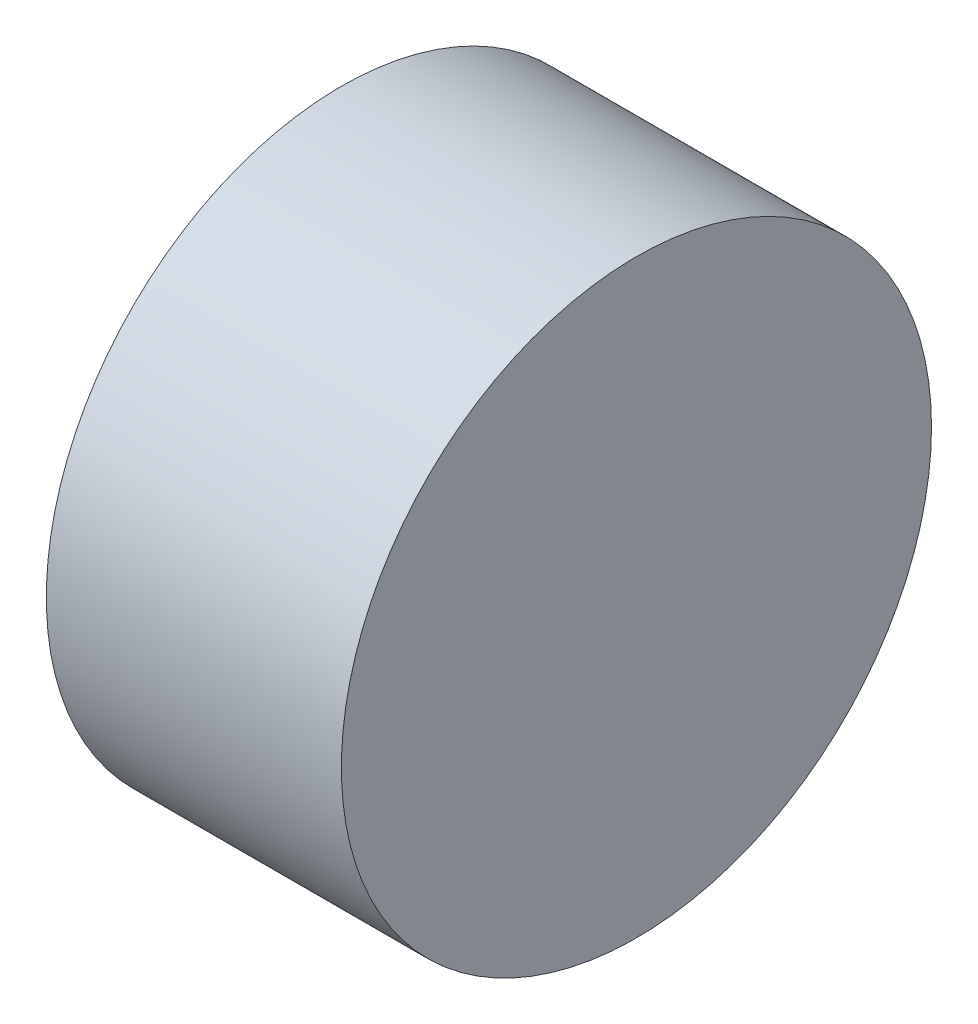
ISO-10303-21;
HEADER;
FILE_DESCRIPTION(('STEP AP214'),'2;1');
FILE_NAME('part.step','',(''),(''),'','','');
FILE_SCHEMA(('AUTOMOTIVE_DESIGN { 1 0 10303 214 1 1 1 1 }'));
ENDSEC;
DATA;
#1=APPLICATION_CONTEXT('core data for automotive mechanical design processes');
#2=APPLICATION_PROTOCOL_DEFINITION('international standard','automotive_design',2000,#1);
#3=PRODUCT_CONTEXT('',#1,'mechanical');
#4=PRODUCT('Part','Part','',(#3));
#5=PRODUCT_RELATED_PRODUCT_CATEGORY('part','',(#4));
#6=PRODUCT_DEFINITION_FORMATION('','',#4);
#7=PRODUCT_DEFINITION_CONTEXT('part definition',#1,'design');
#8=PRODUCT_DEFINITION('design','',#6,#7);
#9=PRODUCT_DEFINITION_SHAPE('','',#8);
#10=(LENGTH_UNIT() NAMED_UNIT(*) SI_UNIT(.MILLI.,.METRE.));
#11=(NAMED_UNIT(*) PLANE_ANGLE_UNIT() SI_UNIT($,.RADIAN.));
#12=(NAMED_UNIT(*) SI_UNIT($,.STERADIAN.) SOLID_ANGLE_UNIT());
#13=UNCERTAINTY_MEASURE_WITH_UNIT(LENGTH_MEASURE(1.E-05),#10,'distance_accuracy_value','');
#14=(GEOMETRIC_REPRESENTATION_CONTEXT(3) GLOBAL_UNCERTAINTY_ASSIGNED_CONTEXT((#13)) GLOBAL_UNIT_ASSIGNED_CONTEXT((#10,
#11,#12)) REPRESENTATION_CONTEXT('',''));
#15=CARTESIAN_POINT('',(0.,0.,0.));
#16=DIRECTION('',(0.,0.,1.));
#17=DIRECTION('',(1.,0.,0.));
#18=AXIS2_PLACEMENT_3D('',#15,#16,#17);
#19=CARTESIAN_POINT('',(1.,0.,0.));
#20=DIRECTION('',(-1.,0.,0.));
#21=DIRECTION('',(0.,0.,1.));
#22=AXIS2_PLACEMENT_3D('',#19,#20,#21);
#23=CYLINDRICAL_SURFACE('',#22,1.);
#24=CARTESIAN_POINT('',(1.,0.,0.));
#25=DIRECTION('',(1.,0.,0.));
#26=DIRECTION('',(0.,0.,-1.));
#27=AXIS2_PLACEMENT_3D('',#24,#25,#26);
#28=CIRCLE('',#27,1.);
#29=CARTESIAN_POINT('',(1.,0.,-1.));
#30=VERTEX_POINT('',#29);
#31=EDGE_CURVE('E10',#30,#30,#28,.T.);
#32=ORIENTED_EDGE('',*,*,#31,.F.);
#33=EDGE_LOOP('',(#32));
#34=FACE_BOUND('',#33,.T.);
#35=CARTESIAN_POINT('',(0.,0.,0.));
#36=DIRECTION('',(1.,0.,0.));
#37=DIRECTION('',(0.,0.,-1.));
#38=AXIS2_PLACEMENT_3D('',#35,#36,#37);
#39=CIRCLE('',#38,1.);
#40=CARTESIAN_POINT('',(0.,0.,-1.));
#41=VERTEX_POINT('',#40);
#42=EDGE_CURVE('E34',#41,#41,#39,.T.);
#43=ORIENTED_EDGE('',*,*,#42,.T.);
#44=EDGE_LOOP('',(#43));
#45=FACE_BOUND('',#44,.T.);
#46=ADVANCED_FACE('F31',(#34,#45),#23,.T.);
#47=CARTESIAN_POINT('',(1.,0.,0.));
#48=DIRECTION('',(1.,0.,0.));
#49=DIRECTION('',(0.,0.,-1.));
#50=AXIS2_PLACEMENT_3D('',#47,#48,#49);
#51=PLANE('',#50);
#52=ORIENTED_EDGE('',*,*,#31,.T.);
#53=EDGE_LOOP('',(#52));
#54=FACE_BOUND('',#53,.T.);
#55=ADVANCED_FACE('F46',(#54),#51,.T.);
#56=CARTESIAN_POINT('',(0.,0.,0.));
#57=DIRECTION('',(1.,0.,0.));
#58=DIRECTION('',(0.,0.,-1.));
#59=AXIS2_PLACEMENT_3D('',#56,#57,#58);
#60=PLANE('',#59);
#61=ORIENTED_EDGE('',*,*,#42,.F.);
#62=EDGE_LOOP('',(#61));
#63=FACE_BOUND('',#62,.T.);
#64=ADVANCED_FACE('F44',(#63),#60,.F.);
#65=CLOSED_SHELL('',(#46,#55,#64));
#66=MANIFOLD_SOLID_BREP('B2',#65);
#67=ADVANCED_BREP_SHAPE_REPRESENTATION('',(#18,#66),#14);
#68=SHAPE_DEFINITION_REPRESENTATION(#9,#67);
ENDSEC;
END-ISO-10303-21;
